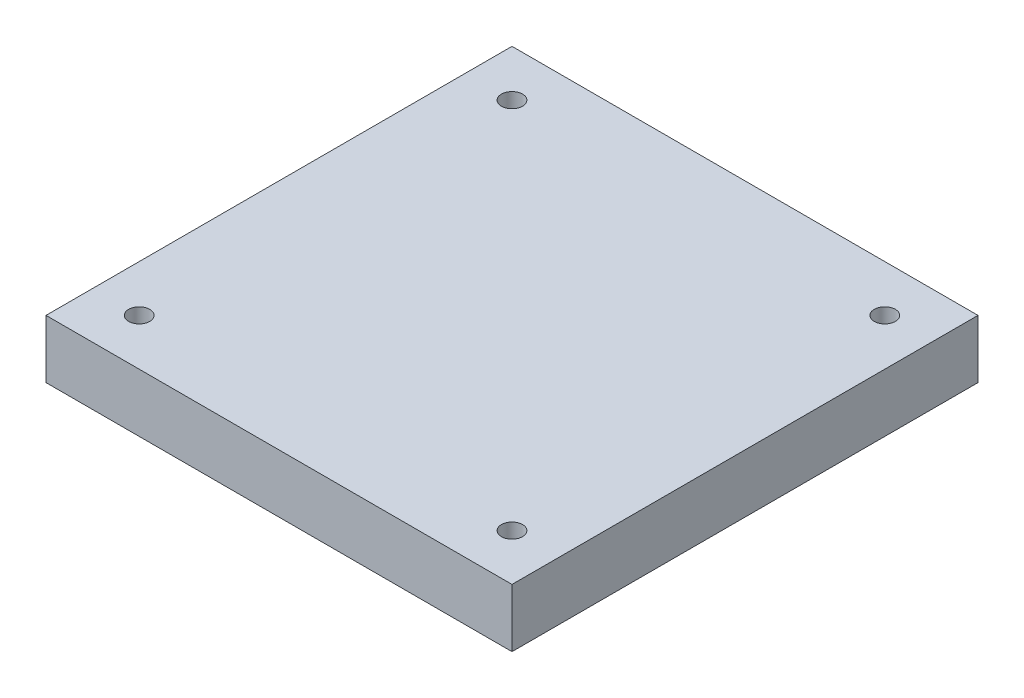
ISO-10303-21;
HEADER;
FILE_DESCRIPTION(('STEP AP214'),'2;1');
FILE_NAME('part.step','',(''),(''),'','','');
FILE_SCHEMA(('AUTOMOTIVE_DESIGN { 1 0 10303 214 1 1 1 1 }'));
ENDSEC;
DATA;
#1=APPLICATION_CONTEXT('core data for automotive mechanical design processes');
#2=APPLICATION_PROTOCOL_DEFINITION('international standard','automotive_design',2000,#1);
#3=PRODUCT_CONTEXT('',#1,'mechanical');
#4=PRODUCT('Part','Part','',(#3));
#5=PRODUCT_RELATED_PRODUCT_CATEGORY('part','',(#4));
#6=PRODUCT_DEFINITION_FORMATION('','',#4);
#7=PRODUCT_DEFINITION_CONTEXT('part definition',#1,'design');
#8=PRODUCT_DEFINITION('design','',#6,#7);
#9=PRODUCT_DEFINITION_SHAPE('','',#8);
#10=(LENGTH_UNIT() NAMED_UNIT(*) SI_UNIT(.MILLI.,.METRE.));
#11=(NAMED_UNIT(*) PLANE_ANGLE_UNIT() SI_UNIT($,.RADIAN.));
#12=(NAMED_UNIT(*) SI_UNIT($,.STERADIAN.) SOLID_ANGLE_UNIT());
#13=UNCERTAINTY_MEASURE_WITH_UNIT(LENGTH_MEASURE(1.E-05),#10,'distance_accuracy_value','');
#14=(GEOMETRIC_REPRESENTATION_CONTEXT(3) GLOBAL_UNCERTAINTY_ASSIGNED_CONTEXT((#13)) GLOBAL_UNIT_ASSIGNED_CONTEXT((#10,
#11,#12)) REPRESENTATION_CONTEXT('',''));
#15=CARTESIAN_POINT('',(0.,0.,0.));
#16=DIRECTION('',(0.,0.,1.));
#17=DIRECTION('',(1.,0.,0.));
#18=AXIS2_PLACEMENT_3D('',#15,#16,#17);
#19=CARTESIAN_POINT('',(0.,5.953125,0.));
#20=DIRECTION('',(0.,1.,0.));
#21=DIRECTION('',(0.,0.,1.));
#22=AXIS2_PLACEMENT_3D('',#19,#20,#21);
#23=PLANE('',#22);
#24=CARTESIAN_POINT('',(-38.1,5.953125,-38.1));
#25=DIRECTION('',(0.,-1.,0.));
#26=DIRECTION('',(0.,0.,-1.));
#27=AXIS2_PLACEMENT_3D('',#24,#25,#26);
#28=CIRCLE('',#27,2.15265);
#29=CARTESIAN_POINT('',(-38.1,5.953125,-40.25265));
#30=VERTEX_POINT('',#29);
#31=EDGE_CURVE('E193',#30,#30,#28,.T.);
#32=ORIENTED_EDGE('',*,*,#31,.T.);
#33=EDGE_LOOP('',(#32));
#34=FACE_BOUND('',#33,.T.);
#35=CARTESIAN_POINT('',(38.1,5.953125,38.1));
#36=DIRECTION('',(0.,-1.,0.));
#37=DIRECTION('',(0.,0.,-1.));
#38=AXIS2_PLACEMENT_3D('',#35,#36,#37);
#39=CIRCLE('',#38,2.15265);
#40=CARTESIAN_POINT('',(38.1,5.953125,35.94735));
#41=VERTEX_POINT('',#40);
#42=EDGE_CURVE('E179',#41,#41,#39,.T.);
#43=ORIENTED_EDGE('',*,*,#42,.T.);
#44=EDGE_LOOP('',(#43));
#45=FACE_BOUND('',#44,.T.);
#46=CARTESIAN_POINT('',(38.1,5.953125,-38.1));
#47=DIRECTION('',(0.,-1.,0.));
#48=DIRECTION('',(0.,0.,-1.));
#49=AXIS2_PLACEMENT_3D('',#46,#47,#48);
#50=CIRCLE('',#49,2.15265);
#51=CARTESIAN_POINT('',(38.1,5.953125,-40.25265));
#52=VERTEX_POINT('',#51);
#53=EDGE_CURVE('E162',#52,#52,#50,.T.);
#54=ORIENTED_EDGE('',*,*,#53,.T.);
#55=EDGE_LOOP('',(#54));
#56=FACE_BOUND('',#55,.T.);
#57=CARTESIAN_POINT('',(-38.1,5.953125,38.1));
#58=DIRECTION('',(0.,-1.,0.));
#59=DIRECTION('',(0.,0.,-1.));
#60=AXIS2_PLACEMENT_3D('',#57,#58,#59);
#61=CIRCLE('',#60,2.15265);
#62=CARTESIAN_POINT('',(-38.1,5.953125,35.94735));
#63=VERTEX_POINT('',#62);
#64=EDGE_CURVE('E119',#63,#63,#61,.T.);
#65=ORIENTED_EDGE('',*,*,#64,.T.);
#66=EDGE_LOOP('',(#65));
#67=FACE_BOUND('',#66,.T.);
#68=DIRECTION('',(1.,0.,0.));
#69=VECTOR('',#68,1.);
#70=CARTESIAN_POINT('',(-47.625,5.953125,47.625));
#71=LINE('',#70,#69);
#72=CARTESIAN_POINT('',(-47.625,5.953125,47.625));
#73=VERTEX_POINT('',#72);
#74=CARTESIAN_POINT('',(47.625,5.953125,47.625));
#75=VERTEX_POINT('',#74);
#76=EDGE_CURVE('E95',#73,#75,#71,.T.);
#77=ORIENTED_EDGE('',*,*,#76,.T.);
#78=DIRECTION('',(0.,0.,-1.));
#79=VECTOR('',#78,1.);
#80=CARTESIAN_POINT('',(47.625,5.953125,47.625));
#81=LINE('',#80,#79);
#82=CARTESIAN_POINT('',(47.625,5.953125,-47.625));
#83=VERTEX_POINT('',#82);
#84=EDGE_CURVE('E114',#75,#83,#81,.T.);
#85=ORIENTED_EDGE('',*,*,#84,.T.);
#86=DIRECTION('',(-1.,0.,0.));
#87=VECTOR('',#86,1.);
#88=CARTESIAN_POINT('',(-47.625,5.953125,-47.625));
#89=LINE('',#88,#87);
#90=CARTESIAN_POINT('',(-47.625,5.953125,-47.625));
#91=VERTEX_POINT('',#90);
#92=EDGE_CURVE('E118',#83,#91,#89,.T.);
#93=ORIENTED_EDGE('',*,*,#92,.T.);
#94=DIRECTION('',(0.,0.,1.));
#95=VECTOR('',#94,1.);
#96=CARTESIAN_POINT('',(-47.625,5.953125,47.625));
#97=LINE('',#96,#95);
#98=EDGE_CURVE('E73',#91,#73,#97,.T.);
#99=ORIENTED_EDGE('',*,*,#98,.T.);
#100=EDGE_LOOP('',(#77,#85,#93,#99));
#101=FACE_BOUND('',#100,.T.);
#102=ADVANCED_FACE('F48',(#34,#45,#56,#67,#101),#23,.T.);
#103=CARTESIAN_POINT('',(47.625,-5.953125,47.625));
#104=DIRECTION('',(1.,0.,0.));
#105=DIRECTION('',(0.,0.,-1.));
#106=AXIS2_PLACEMENT_3D('',#103,#104,#105);
#107=PLANE('',#106);
#108=ORIENTED_EDGE('',*,*,#84,.F.);
#109=DIRECTION('',(0.,1.,0.));
#110=VECTOR('',#109,1.);
#111=CARTESIAN_POINT('',(47.625,-5.953125,47.625));
#112=LINE('',#111,#110);
#113=CARTESIAN_POINT('',(47.625,-5.953125,47.625));
#114=VERTEX_POINT('',#113);
#115=EDGE_CURVE('E12',#114,#75,#112,.T.);
#116=ORIENTED_EDGE('',*,*,#115,.F.);
#117=DIRECTION('',(0.,0.,-1.));
#118=VECTOR('',#117,1.);
#119=CARTESIAN_POINT('',(47.625,-5.953125,47.625));
#120=LINE('',#119,#118);
#121=CARTESIAN_POINT('',(47.625,-5.953125,-47.625));
#122=VERTEX_POINT('',#121);
#123=EDGE_CURVE('E65',#114,#122,#120,.T.);
#124=ORIENTED_EDGE('',*,*,#123,.T.);
#125=DIRECTION('',(0.,1.,0.));
#126=VECTOR('',#125,1.);
#127=CARTESIAN_POINT('',(47.625,-5.953125,-47.625));
#128=LINE('',#127,#126);
#129=EDGE_CURVE('E51',#122,#83,#128,.T.);
#130=ORIENTED_EDGE('',*,*,#129,.T.);
#131=EDGE_LOOP('',(#108,#116,#124,#130));
#132=FACE_BOUND('',#131,.T.);
#133=ADVANCED_FACE('F132',(#132),#107,.T.);
#134=CARTESIAN_POINT('',(-47.625,-5.953125,47.625));
#135=DIRECTION('',(0.,0.,1.));
#136=DIRECTION('',(1.,0.,0.));
#137=AXIS2_PLACEMENT_3D('',#134,#135,#136);
#138=PLANE('',#137);
#139=ORIENTED_EDGE('',*,*,#76,.F.);
#140=DIRECTION('',(0.,1.,0.));
#141=VECTOR('',#140,1.);
#142=CARTESIAN_POINT('',(-47.625,-5.953125,47.625));
#143=LINE('',#142,#141);
#144=CARTESIAN_POINT('',(-47.625,-5.953125,47.625));
#145=VERTEX_POINT('',#144);
#146=EDGE_CURVE('E57',#145,#73,#143,.T.);
#147=ORIENTED_EDGE('',*,*,#146,.F.);
#148=DIRECTION('',(1.,0.,0.));
#149=VECTOR('',#148,1.);
#150=CARTESIAN_POINT('',(-47.625,-5.953125,47.625));
#151=LINE('',#150,#149);
#152=EDGE_CURVE('E93',#145,#114,#151,.T.);
#153=ORIENTED_EDGE('',*,*,#152,.T.);
#154=ORIENTED_EDGE('',*,*,#115,.T.);
#155=EDGE_LOOP('',(#139,#147,#153,#154));
#156=FACE_BOUND('',#155,.T.);
#157=ADVANCED_FACE('F91',(#156),#138,.T.);
#158=CARTESIAN_POINT('',(-47.625,-5.953125,47.625));
#159=DIRECTION('',(-1.,0.,0.));
#160=DIRECTION('',(0.,0.,1.));
#161=AXIS2_PLACEMENT_3D('',#158,#159,#160);
#162=PLANE('',#161);
#163=ORIENTED_EDGE('',*,*,#98,.F.);
#164=DIRECTION('',(0.,1.,0.));
#165=VECTOR('',#164,1.);
#166=CARTESIAN_POINT('',(-47.625,-5.953125,-47.625));
#167=LINE('',#166,#165);
#168=CARTESIAN_POINT('',(-47.625,-5.953125,-47.625));
#169=VERTEX_POINT('',#168);
#170=EDGE_CURVE('E97',#169,#91,#167,.T.);
#171=ORIENTED_EDGE('',*,*,#170,.F.);
#172=DIRECTION('',(0.,0.,1.));
#173=VECTOR('',#172,1.);
#174=CARTESIAN_POINT('',(-47.625,-5.953125,47.625));
#175=LINE('',#174,#173);
#176=EDGE_CURVE('E100',#169,#145,#175,.T.);
#177=ORIENTED_EDGE('',*,*,#176,.T.);
#178=ORIENTED_EDGE('',*,*,#146,.T.);
#179=EDGE_LOOP('',(#163,#171,#177,#178));
#180=FACE_BOUND('',#179,.T.);
#181=ADVANCED_FACE('F101',(#180),#162,.T.);
#182=CARTESIAN_POINT('',(-47.625,-5.953125,-47.625));
#183=DIRECTION('',(0.,0.,-1.));
#184=DIRECTION('',(-1.,0.,0.));
#185=AXIS2_PLACEMENT_3D('',#182,#183,#184);
#186=PLANE('',#185);
#187=ORIENTED_EDGE('',*,*,#92,.F.);
#188=ORIENTED_EDGE('',*,*,#129,.F.);
#189=DIRECTION('',(-1.,0.,0.));
#190=VECTOR('',#189,1.);
#191=CARTESIAN_POINT('',(-47.625,-5.953125,-47.625));
#192=LINE('',#191,#190);
#193=EDGE_CURVE('E106',#122,#169,#192,.T.);
#194=ORIENTED_EDGE('',*,*,#193,.T.);
#195=ORIENTED_EDGE('',*,*,#170,.T.);
#196=EDGE_LOOP('',(#187,#188,#194,#195));
#197=FACE_BOUND('',#196,.T.);
#198=ADVANCED_FACE('F129',(#197),#186,.T.);
#199=CARTESIAN_POINT('',(0.,-5.953125,0.));
#200=DIRECTION('',(0.,-1.,0.));
#201=DIRECTION('',(0.,0.,-1.));
#202=AXIS2_PLACEMENT_3D('',#199,#200,#201);
#203=PLANE('',#202);
#204=CARTESIAN_POINT('',(-38.1,-5.953125,-38.1));
#205=DIRECTION('',(0.,-1.,0.));
#206=DIRECTION('',(0.,0.,-1.));
#207=AXIS2_PLACEMENT_3D('',#204,#205,#206);
#208=CIRCLE('',#207,3.96875);
#209=CARTESIAN_POINT('',(-38.1,-5.953125,-42.06875));
#210=VERTEX_POINT('',#209);
#211=EDGE_CURVE('E174',#210,#210,#208,.T.);
#212=ORIENTED_EDGE('',*,*,#211,.F.);
#213=EDGE_LOOP('',(#212));
#214=FACE_BOUND('',#213,.T.);
#215=CARTESIAN_POINT('',(38.1,-5.953125,38.1));
#216=DIRECTION('',(0.,-1.,0.));
#217=DIRECTION('',(0.,0.,-1.));
#218=AXIS2_PLACEMENT_3D('',#215,#216,#217);
#219=CIRCLE('',#218,3.96875);
#220=CARTESIAN_POINT('',(38.1,-5.953125,34.13125));
#221=VERTEX_POINT('',#220);
#222=EDGE_CURVE('E157',#221,#221,#219,.T.);
#223=ORIENTED_EDGE('',*,*,#222,.F.);
#224=EDGE_LOOP('',(#223));
#225=FACE_BOUND('',#224,.T.);
#226=CARTESIAN_POINT('',(38.1,-5.953125,-38.1));
#227=DIRECTION('',(0.,-1.,0.));
#228=DIRECTION('',(0.,0.,-1.));
#229=AXIS2_PLACEMENT_3D('',#226,#227,#228);
#230=CIRCLE('',#229,3.96875);
#231=CARTESIAN_POINT('',(38.1,-5.953125,-42.06875));
#232=VERTEX_POINT('',#231);
#233=EDGE_CURVE('E166',#232,#232,#230,.T.);
#234=ORIENTED_EDGE('',*,*,#233,.F.);
#235=EDGE_LOOP('',(#234));
#236=FACE_BOUND('',#235,.T.);
#237=CARTESIAN_POINT('',(-38.1,-5.953125,38.1));
#238=DIRECTION('',(0.,-1.,0.));
#239=DIRECTION('',(0.,0.,-1.));
#240=AXIS2_PLACEMENT_3D('',#237,#238,#239);
#241=CIRCLE('',#240,3.96875);
#242=CARTESIAN_POINT('',(-38.1,-5.953125,34.13125));
#243=VERTEX_POINT('',#242);
#244=EDGE_CURVE('E148',#243,#243,#241,.T.);
#245=ORIENTED_EDGE('',*,*,#244,.F.);
#246=EDGE_LOOP('',(#245));
#247=FACE_BOUND('',#246,.T.);
#248=ORIENTED_EDGE('',*,*,#193,.F.);
#249=ORIENTED_EDGE('',*,*,#123,.F.);
#250=ORIENTED_EDGE('',*,*,#152,.F.);
#251=ORIENTED_EDGE('',*,*,#176,.F.);
#252=EDGE_LOOP('',(#248,#249,#250,#251));
#253=FACE_BOUND('',#252,.T.);
#254=ADVANCED_FACE('F108',(#214,#225,#236,#247,#253),#203,.T.);
#255=CARTESIAN_POINT('',(-38.1,-5.953125,38.1));
#256=DIRECTION('',(0.,-1.,0.));
#257=DIRECTION('',(0.,0.,-1.));
#258=AXIS2_PLACEMENT_3D('',#255,#256,#257);
#259=CYLINDRICAL_SURFACE('',#258,2.15265);
#260=ORIENTED_EDGE('',*,*,#64,.F.);
#261=EDGE_LOOP('',(#260));
#262=FACE_BOUND('',#261,.T.);
#263=CARTESIAN_POINT('',(-38.1,-0.568325000000002,38.1));
#264=DIRECTION('',(0.,-1.,0.));
#265=DIRECTION('',(0.,0.,-1.));
#266=AXIS2_PLACEMENT_3D('',#263,#264,#265);
#267=CIRCLE('',#266,2.15265);
#268=CARTESIAN_POINT('',(-38.1,-0.568325000000002,35.94735));
#269=VERTEX_POINT('',#268);
#270=EDGE_CURVE('E140',#269,#269,#267,.T.);
#271=ORIENTED_EDGE('',*,*,#270,.T.);
#272=EDGE_LOOP('',(#271));
#273=FACE_BOUND('',#272,.T.);
#274=ADVANCED_FACE('F205',(#262,#273),#259,.F.);
#275=CARTESIAN_POINT('',(-35.94735,-0.568325000000002,38.1));
#276=DIRECTION('',(0.,1.,0.));
#277=DIRECTION('',(0.,0.,1.));
#278=AXIS2_PLACEMENT_3D('',#275,#276,#277);
#279=PLANE('',#278);
#280=ORIENTED_EDGE('',*,*,#270,.F.);
#281=EDGE_LOOP('',(#280));
#282=FACE_BOUND('',#281,.T.);
#283=CARTESIAN_POINT('',(-38.1,-0.568325000000002,38.1));
#284=DIRECTION('',(0.,-1.,0.));
#285=DIRECTION('',(0.,0.,-1.));
#286=AXIS2_PLACEMENT_3D('',#283,#284,#285);
#287=CIRCLE('',#286,3.96875);
#288=CARTESIAN_POINT('',(-38.1,-0.568325000000002,34.13125));
#289=VERTEX_POINT('',#288);
#290=EDGE_CURVE('E144',#289,#289,#287,.T.);
#291=ORIENTED_EDGE('',*,*,#290,.T.);
#292=EDGE_LOOP('',(#291));
#293=FACE_BOUND('',#292,.T.);
#294=ADVANCED_FACE('F215',(#282,#293),#279,.F.);
#295=CARTESIAN_POINT('',(-38.1,-5.953125,38.1));
#296=DIRECTION('',(0.,-1.,0.));
#297=DIRECTION('',(0.,0.,-1.));
#298=AXIS2_PLACEMENT_3D('',#295,#296,#297);
#299=CYLINDRICAL_SURFACE('',#298,3.96875);
#300=ORIENTED_EDGE('',*,*,#290,.F.);
#301=EDGE_LOOP('',(#300));
#302=FACE_BOUND('',#301,.T.);
#303=ORIENTED_EDGE('',*,*,#244,.T.);
#304=EDGE_LOOP('',(#303));
#305=FACE_BOUND('',#304,.T.);
#306=ADVANCED_FACE('F212',(#302,#305),#299,.F.);
#307=CARTESIAN_POINT('',(38.1,-5.953125,-38.1));
#308=DIRECTION('',(0.,-1.,0.));
#309=DIRECTION('',(0.,0.,-1.));
#310=AXIS2_PLACEMENT_3D('',#307,#308,#309);
#311=CYLINDRICAL_SURFACE('',#310,2.15265);
#312=ORIENTED_EDGE('',*,*,#53,.F.);
#313=EDGE_LOOP('',(#312));
#314=FACE_BOUND('',#313,.T.);
#315=CARTESIAN_POINT('',(38.1,-0.568325000000002,-38.1));
#316=DIRECTION('',(0.,-1.,0.));
#317=DIRECTION('',(0.,0.,-1.));
#318=AXIS2_PLACEMENT_3D('',#315,#316,#317);
#319=CIRCLE('',#318,2.15265);
#320=CARTESIAN_POINT('',(38.1,-0.568325000000002,-40.25265));
#321=VERTEX_POINT('',#320);
#322=EDGE_CURVE('E153',#321,#321,#319,.T.);
#323=ORIENTED_EDGE('',*,*,#322,.T.);
#324=EDGE_LOOP('',(#323));
#325=FACE_BOUND('',#324,.T.);
#326=ADVANCED_FACE('F214',(#314,#325),#311,.F.);
#327=CARTESIAN_POINT('',(40.25265,-0.568325000000002,-38.1));
#328=DIRECTION('',(0.,1.,0.));
#329=DIRECTION('',(0.,0.,1.));
#330=AXIS2_PLACEMENT_3D('',#327,#328,#329);
#331=PLANE('',#330);
#332=ORIENTED_EDGE('',*,*,#322,.F.);
#333=EDGE_LOOP('',(#332));
#334=FACE_BOUND('',#333,.T.);
#335=CARTESIAN_POINT('',(38.1,-0.568325000000002,-38.1));
#336=DIRECTION('',(0.,-1.,0.));
#337=DIRECTION('',(0.,0.,-1.));
#338=AXIS2_PLACEMENT_3D('',#335,#336,#337);
#339=CIRCLE('',#338,3.96875);
#340=CARTESIAN_POINT('',(38.1,-0.568325000000002,-42.06875));
#341=VERTEX_POINT('',#340);
#342=EDGE_CURVE('E158',#341,#341,#339,.T.);
#343=ORIENTED_EDGE('',*,*,#342,.T.);
#344=EDGE_LOOP('',(#343));
#345=FACE_BOUND('',#344,.T.);
#346=ADVANCED_FACE('F222',(#334,#345),#331,.F.);
#347=CARTESIAN_POINT('',(38.1,-5.953125,-38.1));
#348=DIRECTION('',(0.,-1.,0.));
#349=DIRECTION('',(0.,0.,-1.));
#350=AXIS2_PLACEMENT_3D('',#347,#348,#349);
#351=CYLINDRICAL_SURFACE('',#350,3.96875);
#352=ORIENTED_EDGE('',*,*,#342,.F.);
#353=EDGE_LOOP('',(#352));
#354=FACE_BOUND('',#353,.T.);
#355=ORIENTED_EDGE('',*,*,#233,.T.);
#356=EDGE_LOOP('',(#355));
#357=FACE_BOUND('',#356,.T.);
#358=ADVANCED_FACE('F283',(#354,#357),#351,.F.);
#359=CARTESIAN_POINT('',(38.1,-5.953125,38.1));
#360=DIRECTION('',(0.,-1.,0.));
#361=DIRECTION('',(0.,0.,-1.));
#362=AXIS2_PLACEMENT_3D('',#359,#360,#361);
#363=CYLINDRICAL_SURFACE('',#362,2.15265);
#364=ORIENTED_EDGE('',*,*,#42,.F.);
#365=EDGE_LOOP('',(#364));
#366=FACE_BOUND('',#365,.T.);
#367=CARTESIAN_POINT('',(38.1,-0.568325000000002,38.1));
#368=DIRECTION('',(0.,-1.,0.));
#369=DIRECTION('',(0.,0.,-1.));
#370=AXIS2_PLACEMENT_3D('',#367,#368,#369);
#371=CIRCLE('',#370,2.15265);
#372=CARTESIAN_POINT('',(38.1,-0.568325000000002,35.94735));
#373=VERTEX_POINT('',#372);
#374=EDGE_CURVE('E170',#373,#373,#371,.T.);
#375=ORIENTED_EDGE('',*,*,#374,.T.);
#376=EDGE_LOOP('',(#375));
#377=FACE_BOUND('',#376,.T.);
#378=ADVANCED_FACE('F294',(#366,#377),#363,.F.);
#379=CARTESIAN_POINT('',(40.25265,-0.568325000000002,38.1));
#380=DIRECTION('',(0.,1.,0.));
#381=DIRECTION('',(0.,0.,1.));
#382=AXIS2_PLACEMENT_3D('',#379,#380,#381);
#383=PLANE('',#382);
#384=ORIENTED_EDGE('',*,*,#374,.F.);
#385=EDGE_LOOP('',(#384));
#386=FACE_BOUND('',#385,.T.);
#387=CARTESIAN_POINT('',(38.1,-0.568325000000002,38.1));
#388=DIRECTION('',(0.,-1.,0.));
#389=DIRECTION('',(0.,0.,-1.));
#390=AXIS2_PLACEMENT_3D('',#387,#388,#389);
#391=CIRCLE('',#390,3.96875);
#392=CARTESIAN_POINT('',(38.1,-0.568325000000002,34.13125));
#393=VERTEX_POINT('',#392);
#394=EDGE_CURVE('E175',#393,#393,#391,.T.);
#395=ORIENTED_EDGE('',*,*,#394,.T.);
#396=EDGE_LOOP('',(#395));
#397=FACE_BOUND('',#396,.T.);
#398=ADVANCED_FACE('F305',(#386,#397),#383,.F.);
#399=CARTESIAN_POINT('',(38.1,-5.953125,38.1));
#400=DIRECTION('',(0.,-1.,0.));
#401=DIRECTION('',(0.,0.,-1.));
#402=AXIS2_PLACEMENT_3D('',#399,#400,#401);
#403=CYLINDRICAL_SURFACE('',#402,3.96875);
#404=ORIENTED_EDGE('',*,*,#394,.F.);
#405=EDGE_LOOP('',(#404));
#406=FACE_BOUND('',#405,.T.);
#407=ORIENTED_EDGE('',*,*,#222,.T.);
#408=EDGE_LOOP('',(#407));
#409=FACE_BOUND('',#408,.T.);
#410=ADVANCED_FACE('F316',(#406,#409),#403,.F.);
#411=CARTESIAN_POINT('',(-38.1,-5.953125,-38.1));
#412=DIRECTION('',(0.,-1.,0.));
#413=DIRECTION('',(0.,0.,-1.));
#414=AXIS2_PLACEMENT_3D('',#411,#412,#413);
#415=CYLINDRICAL_SURFACE('',#414,2.15265);
#416=ORIENTED_EDGE('',*,*,#31,.F.);
#417=EDGE_LOOP('',(#416));
#418=FACE_BOUND('',#417,.T.);
#419=CARTESIAN_POINT('',(-38.1,-0.568325000000002,-38.1));
#420=DIRECTION('',(0.,-1.,0.));
#421=DIRECTION('',(0.,0.,-1.));
#422=AXIS2_PLACEMENT_3D('',#419,#420,#421);
#423=CIRCLE('',#422,2.15265);
#424=CARTESIAN_POINT('',(-38.1,-0.568325000000002,-40.25265));
#425=VERTEX_POINT('',#424);
#426=EDGE_CURVE('E152',#425,#425,#423,.T.);
#427=ORIENTED_EDGE('',*,*,#426,.T.);
#428=EDGE_LOOP('',(#427));
#429=FACE_BOUND('',#428,.T.);
#430=ADVANCED_FACE('F327',(#418,#429),#415,.F.);
#431=CARTESIAN_POINT('',(-35.94735,-0.568325000000002,-38.1));
#432=DIRECTION('',(0.,1.,0.));
#433=DIRECTION('',(0.,0.,1.));
#434=AXIS2_PLACEMENT_3D('',#431,#432,#433);
#435=PLANE('',#434);
#436=ORIENTED_EDGE('',*,*,#426,.F.);
#437=EDGE_LOOP('',(#436));
#438=FACE_BOUND('',#437,.T.);
#439=CARTESIAN_POINT('',(-38.1,-0.568325000000002,-38.1));
#440=DIRECTION('',(0.,-1.,0.));
#441=DIRECTION('',(0.,0.,-1.));
#442=AXIS2_PLACEMENT_3D('',#439,#440,#441);
#443=CIRCLE('',#442,3.96875);
#444=CARTESIAN_POINT('',(-38.1,-0.568325000000002,-42.06875));
#445=VERTEX_POINT('',#444);
#446=EDGE_CURVE('E189',#445,#445,#443,.T.);
#447=ORIENTED_EDGE('',*,*,#446,.T.);
#448=EDGE_LOOP('',(#447));
#449=FACE_BOUND('',#448,.T.);
#450=ADVANCED_FACE('F338',(#438,#449),#435,.F.);
#451=CARTESIAN_POINT('',(-38.1,-5.953125,-38.1));
#452=DIRECTION('',(0.,-1.,0.));
#453=DIRECTION('',(0.,0.,-1.));
#454=AXIS2_PLACEMENT_3D('',#451,#452,#453);
#455=CYLINDRICAL_SURFACE('',#454,3.96875);
#456=ORIENTED_EDGE('',*,*,#446,.F.);
#457=EDGE_LOOP('',(#456));
#458=FACE_BOUND('',#457,.T.);
#459=ORIENTED_EDGE('',*,*,#211,.T.);
#460=EDGE_LOOP('',(#459));
#461=FACE_BOUND('',#460,.T.);
#462=ADVANCED_FACE('F201',(#458,#461),#455,.F.);
#463=CLOSED_SHELL('',(#102,#133,#157,#181,#198,#254,#274,#294,#306,#326,#346,#358,#378,#398,
#410,#430,#450,#462));
#464=MANIFOLD_SOLID_BREP('B2',#463);
#465=ADVANCED_BREP_SHAPE_REPRESENTATION('',(#18,#464),#14);
#466=SHAPE_DEFINITION_REPRESENTATION(#9,#465);
ENDSEC;
END-ISO-10303-21;
